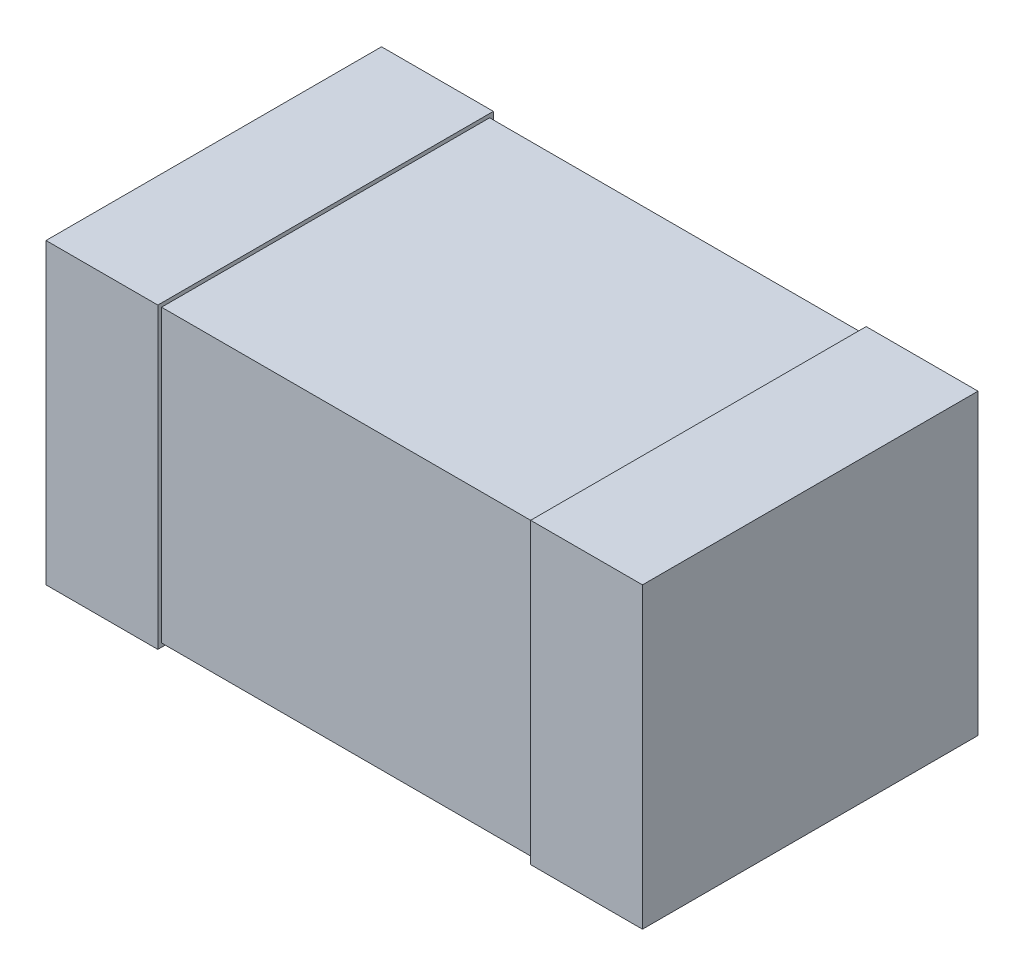
ISO-10303-21;
HEADER;
FILE_DESCRIPTION(('STEP AP214'),'2;1');
FILE_NAME('part.step','',(''),(''),'','','');
FILE_SCHEMA(('AUTOMOTIVE_DESIGN { 1 0 10303 214 1 1 1 1 }'));
ENDSEC;
DATA;
#1=APPLICATION_CONTEXT('core data for automotive mechanical design processes');
#2=APPLICATION_PROTOCOL_DEFINITION('international standard','automotive_design',2000,#1);
#3=PRODUCT_CONTEXT('',#1,'mechanical');
#4=PRODUCT('Part','Part','',(#3));
#5=PRODUCT_RELATED_PRODUCT_CATEGORY('part','',(#4));
#6=PRODUCT_DEFINITION_FORMATION('','',#4);
#7=PRODUCT_DEFINITION_CONTEXT('part definition',#1,'design');
#8=PRODUCT_DEFINITION('design','',#6,#7);
#9=PRODUCT_DEFINITION_SHAPE('','',#8);
#10=(LENGTH_UNIT() NAMED_UNIT(*) SI_UNIT(.MILLI.,.METRE.));
#11=(NAMED_UNIT(*) PLANE_ANGLE_UNIT() SI_UNIT($,.RADIAN.));
#12=(NAMED_UNIT(*) SI_UNIT($,.STERADIAN.) SOLID_ANGLE_UNIT());
#13=UNCERTAINTY_MEASURE_WITH_UNIT(LENGTH_MEASURE(1.E-05),#10,'distance_accuracy_value','');
#14=(GEOMETRIC_REPRESENTATION_CONTEXT(3) GLOBAL_UNCERTAINTY_ASSIGNED_CONTEXT((#13)) GLOBAL_UNIT_ASSIGNED_CONTEXT((#10,
#11,#12)) REPRESENTATION_CONTEXT('',''));
#15=CARTESIAN_POINT('',(0.,0.,0.));
#16=DIRECTION('',(0.,0.,1.));
#17=DIRECTION('',(1.,0.,0.));
#18=AXIS2_PLACEMENT_3D('',#15,#16,#17);
#19=CARTESIAN_POINT('',(0.8,-0.4,-0.45));
#20=DIRECTION('',(-1.,0.,0.));
#21=DIRECTION('',(0.,0.,1.));
#22=AXIS2_PLACEMENT_3D('',#19,#20,#21);
#23=PLANE('',#22);
#24=DIRECTION('',(0.,0.,-1.));
#25=VECTOR('',#24,1.);
#26=CARTESIAN_POINT('',(0.8,0.4,0.));
#27=LINE('',#26,#25);
#28=CARTESIAN_POINT('',(0.8,0.4,0.45));
#29=VERTEX_POINT('',#28);
#30=CARTESIAN_POINT('',(0.8,0.4,-0.45));
#31=VERTEX_POINT('',#30);
#32=EDGE_CURVE('E126',#29,#31,#27,.T.);
#33=ORIENTED_EDGE('',*,*,#32,.F.);
#34=DIRECTION('',(0.,1.,0.));
#35=VECTOR('',#34,1.);
#36=CARTESIAN_POINT('',(0.8,0.,0.45));
#37=LINE('',#36,#35);
#38=CARTESIAN_POINT('',(0.8,-0.4,0.45));
#39=VERTEX_POINT('',#38);
#40=EDGE_CURVE('E119',#39,#29,#37,.T.);
#41=ORIENTED_EDGE('',*,*,#40,.F.);
#42=DIRECTION('',(0.,0.,1.));
#43=VECTOR('',#42,1.);
#44=CARTESIAN_POINT('',(0.8,-0.4,0.));
#45=LINE('',#44,#43);
#46=CARTESIAN_POINT('',(0.8,-0.4,-0.45));
#47=VERTEX_POINT('',#46);
#48=EDGE_CURVE('E103',#47,#39,#45,.T.);
#49=ORIENTED_EDGE('',*,*,#48,.F.);
#50=DIRECTION('',(0.,-1.,0.));
#51=VECTOR('',#50,1.);
#52=CARTESIAN_POINT('',(0.8,0.,-0.45));
#53=LINE('',#52,#51);
#54=EDGE_CURVE('E20',#31,#47,#53,.T.);
#55=ORIENTED_EDGE('',*,*,#54,.F.);
#56=EDGE_LOOP('',(#33,#41,#49,#55));
#57=FACE_BOUND('',#56,.T.);
#58=ADVANCED_FACE('F16',(#57),#23,.F.);
#59=CARTESIAN_POINT('',(-0.8,-0.4,-0.45));
#60=DIRECTION('',(-1.,0.,0.));
#61=DIRECTION('',(0.,0.,1.));
#62=AXIS2_PLACEMENT_3D('',#59,#60,#61);
#63=PLANE('',#62);
#64=DIRECTION('',(0.,0.,1.));
#65=VECTOR('',#64,1.);
#66=CARTESIAN_POINT('',(-0.8,0.4,0.));
#67=LINE('',#66,#65);
#68=CARTESIAN_POINT('',(-0.8,0.4,-0.45));
#69=VERTEX_POINT('',#68);
#70=CARTESIAN_POINT('',(-0.8,0.4,0.45));
#71=VERTEX_POINT('',#70);
#72=EDGE_CURVE('E134',#69,#71,#67,.T.);
#73=ORIENTED_EDGE('',*,*,#72,.F.);
#74=DIRECTION('',(0.,1.,0.));
#75=VECTOR('',#74,1.);
#76=CARTESIAN_POINT('',(-0.8,0.,-0.45));
#77=LINE('',#76,#75);
#78=CARTESIAN_POINT('',(-0.8,-0.4,-0.45));
#79=VERTEX_POINT('',#78);
#80=EDGE_CURVE('E138',#79,#69,#77,.T.);
#81=ORIENTED_EDGE('',*,*,#80,.F.);
#82=DIRECTION('',(0.,0.,-1.));
#83=VECTOR('',#82,1.);
#84=CARTESIAN_POINT('',(-0.8,-0.4,0.));
#85=LINE('',#84,#83);
#86=CARTESIAN_POINT('',(-0.8,-0.4,0.45));
#87=VERTEX_POINT('',#86);
#88=EDGE_CURVE('E142',#87,#79,#85,.T.);
#89=ORIENTED_EDGE('',*,*,#88,.F.);
#90=DIRECTION('',(0.,-1.,0.));
#91=VECTOR('',#90,1.);
#92=CARTESIAN_POINT('',(-0.8,0.,0.45));
#93=LINE('',#92,#91);
#94=EDGE_CURVE('E132',#71,#87,#93,.T.);
#95=ORIENTED_EDGE('',*,*,#94,.F.);
#96=EDGE_LOOP('',(#73,#81,#89,#95));
#97=FACE_BOUND('',#96,.T.);
#98=ADVANCED_FACE('F232',(#97),#63,.T.);
#99=CARTESIAN_POINT('',(0.8,-0.4,-0.45));
#100=DIRECTION('',(0.,0.,-1.));
#101=DIRECTION('',(-1.,0.,0.));
#102=AXIS2_PLACEMENT_3D('',#99,#100,#101);
#103=PLANE('',#102);
#104=DIRECTION('',(0.,-1.,0.));
#105=VECTOR('',#104,1.);
#106=CARTESIAN_POINT('',(0.5,0.,-0.45));
#107=LINE('',#106,#105);
#108=CARTESIAN_POINT('',(0.5,0.4,-0.45));
#109=VERTEX_POINT('',#108);
#110=CARTESIAN_POINT('',(0.5,-0.4,-0.45));
#111=VERTEX_POINT('',#110);
#112=EDGE_CURVE('E152',#109,#111,#107,.T.);
#113=ORIENTED_EDGE('',*,*,#112,.F.);
#114=DIRECTION('',(-1.,0.,0.));
#115=VECTOR('',#114,1.);
#116=CARTESIAN_POINT('',(0.65,0.4,-0.45));
#117=LINE('',#116,#115);
#118=EDGE_CURVE('E114',#31,#109,#117,.T.);
#119=ORIENTED_EDGE('',*,*,#118,.F.);
#120=ORIENTED_EDGE('',*,*,#54,.T.);
#121=DIRECTION('',(1.,0.,0.));
#122=VECTOR('',#121,1.);
#123=CARTESIAN_POINT('',(0.65,-0.4,-0.45));
#124=LINE('',#123,#122);
#125=EDGE_CURVE('E112',#111,#47,#124,.T.);
#126=ORIENTED_EDGE('',*,*,#125,.F.);
#127=EDGE_LOOP('',(#113,#119,#120,#126));
#128=FACE_BOUND('',#127,.T.);
#129=ADVANCED_FACE('F111',(#128),#103,.T.);
#130=CARTESIAN_POINT('',(0.5,-0.4,0.45));
#131=DIRECTION('',(0.,-1.,0.));
#132=DIRECTION('',(0.,0.,-1.));
#133=AXIS2_PLACEMENT_3D('',#130,#131,#132);
#134=PLANE('',#133);
#135=DIRECTION('',(0.,0.,1.));
#136=VECTOR('',#135,1.);
#137=CARTESIAN_POINT('',(0.5,-0.4,0.));
#138=LINE('',#137,#136);
#139=CARTESIAN_POINT('',(0.5,-0.4,0.45));
#140=VERTEX_POINT('',#139);
#141=EDGE_CURVE('E118',#111,#140,#138,.T.);
#142=ORIENTED_EDGE('',*,*,#141,.F.);
#143=ORIENTED_EDGE('',*,*,#125,.T.);
#144=ORIENTED_EDGE('',*,*,#48,.T.);
#145=DIRECTION('',(1.,0.,0.));
#146=VECTOR('',#145,1.);
#147=CARTESIAN_POINT('',(0.65,-0.4,0.45));
#148=LINE('',#147,#146);
#149=EDGE_CURVE('E124',#140,#39,#148,.T.);
#150=ORIENTED_EDGE('',*,*,#149,.F.);
#151=EDGE_LOOP('',(#142,#143,#144,#150));
#152=FACE_BOUND('',#151,.T.);
#153=ADVANCED_FACE('F117',(#152),#134,.T.);
#154=CARTESIAN_POINT('',(0.5,-0.4,0.45));
#155=DIRECTION('',(0.,0.,1.));
#156=DIRECTION('',(1.,0.,0.));
#157=AXIS2_PLACEMENT_3D('',#154,#155,#156);
#158=PLANE('',#157);
#159=DIRECTION('',(0.,1.,0.));
#160=VECTOR('',#159,1.);
#161=CARTESIAN_POINT('',(0.5,0.,0.45));
#162=LINE('',#161,#160);
#163=CARTESIAN_POINT('',(0.5,0.4,0.45));
#164=VERTEX_POINT('',#163);
#165=EDGE_CURVE('E155',#140,#164,#162,.T.);
#166=ORIENTED_EDGE('',*,*,#165,.F.);
#167=ORIENTED_EDGE('',*,*,#149,.T.);
#168=ORIENTED_EDGE('',*,*,#40,.T.);
#169=DIRECTION('',(1.,0.,0.));
#170=VECTOR('',#169,1.);
#171=CARTESIAN_POINT('',(0.65,0.4,0.45));
#172=LINE('',#171,#170);
#173=EDGE_CURVE('E129',#164,#29,#172,.T.);
#174=ORIENTED_EDGE('',*,*,#173,.F.);
#175=EDGE_LOOP('',(#166,#167,#168,#174));
#176=FACE_BOUND('',#175,.T.);
#177=ADVANCED_FACE('F308',(#176),#158,.T.);
#178=CARTESIAN_POINT('',(0.5,0.4,-0.45));
#179=DIRECTION('',(0.,1.,0.));
#180=DIRECTION('',(0.,0.,1.));
#181=AXIS2_PLACEMENT_3D('',#178,#179,#180);
#182=PLANE('',#181);
#183=DIRECTION('',(0.,0.,-1.));
#184=VECTOR('',#183,1.);
#185=CARTESIAN_POINT('',(0.5,0.4,0.));
#186=LINE('',#185,#184);
#187=EDGE_CURVE('E157',#164,#109,#186,.T.);
#188=ORIENTED_EDGE('',*,*,#187,.F.);
#189=ORIENTED_EDGE('',*,*,#173,.T.);
#190=ORIENTED_EDGE('',*,*,#32,.T.);
#191=ORIENTED_EDGE('',*,*,#118,.T.);
#192=EDGE_LOOP('',(#188,#189,#190,#191));
#193=FACE_BOUND('',#192,.T.);
#194=ADVANCED_FACE('F301',(#193),#182,.T.);
#195=CARTESIAN_POINT('',(-0.8,-0.4,0.45));
#196=DIRECTION('',(0.,0.,1.));
#197=DIRECTION('',(1.,0.,0.));
#198=AXIS2_PLACEMENT_3D('',#195,#196,#197);
#199=PLANE('',#198);
#200=DIRECTION('',(0.,1.,0.));
#201=VECTOR('',#200,1.);
#202=CARTESIAN_POINT('',(-0.5,0.,0.45));
#203=LINE('',#202,#201);
#204=CARTESIAN_POINT('',(-0.5,-0.4,0.45));
#205=VERTEX_POINT('',#204);
#206=CARTESIAN_POINT('',(-0.5,0.4,0.45));
#207=VERTEX_POINT('',#206);
#208=EDGE_CURVE('E170',#205,#207,#203,.T.);
#209=ORIENTED_EDGE('',*,*,#208,.T.);
#210=DIRECTION('',(1.,0.,0.));
#211=VECTOR('',#210,1.);
#212=CARTESIAN_POINT('',(-0.65,0.4,0.45));
#213=LINE('',#212,#211);
#214=EDGE_CURVE('E136',#71,#207,#213,.T.);
#215=ORIENTED_EDGE('',*,*,#214,.F.);
#216=ORIENTED_EDGE('',*,*,#94,.T.);
#217=DIRECTION('',(-1.,0.,0.));
#218=VECTOR('',#217,1.);
#219=CARTESIAN_POINT('',(-0.65,-0.4,0.45));
#220=LINE('',#219,#218);
#221=EDGE_CURVE('E146',#205,#87,#220,.T.);
#222=ORIENTED_EDGE('',*,*,#221,.F.);
#223=EDGE_LOOP('',(#209,#215,#216,#222));
#224=FACE_BOUND('',#223,.T.);
#225=ADVANCED_FACE('F224',(#224),#199,.T.);
#226=CARTESIAN_POINT('',(-0.8,0.4,-0.45));
#227=DIRECTION('',(0.,1.,0.));
#228=DIRECTION('',(0.,0.,1.));
#229=AXIS2_PLACEMENT_3D('',#226,#227,#228);
#230=PLANE('',#229);
#231=DIRECTION('',(0.,0.,-1.));
#232=VECTOR('',#231,1.);
#233=CARTESIAN_POINT('',(-0.5,0.4,0.));
#234=LINE('',#233,#232);
#235=CARTESIAN_POINT('',(-0.5,0.4,-0.45));
#236=VERTEX_POINT('',#235);
#237=EDGE_CURVE('E173',#207,#236,#234,.T.);
#238=ORIENTED_EDGE('',*,*,#237,.T.);
#239=DIRECTION('',(1.,0.,0.));
#240=VECTOR('',#239,1.);
#241=CARTESIAN_POINT('',(-0.65,0.4,-0.45));
#242=LINE('',#241,#240);
#243=EDGE_CURVE('E140',#69,#236,#242,.T.);
#244=ORIENTED_EDGE('',*,*,#243,.F.);
#245=ORIENTED_EDGE('',*,*,#72,.T.);
#246=ORIENTED_EDGE('',*,*,#214,.T.);
#247=EDGE_LOOP('',(#238,#244,#245,#246));
#248=FACE_BOUND('',#247,.T.);
#249=ADVANCED_FACE('F219',(#248),#230,.T.);
#250=CARTESIAN_POINT('',(-0.5,-0.4,-0.45));
#251=DIRECTION('',(0.,0.,-1.));
#252=DIRECTION('',(-1.,0.,0.));
#253=AXIS2_PLACEMENT_3D('',#250,#251,#252);
#254=PLANE('',#253);
#255=DIRECTION('',(0.,-1.,0.));
#256=VECTOR('',#255,1.);
#257=CARTESIAN_POINT('',(-0.5,0.,-0.45));
#258=LINE('',#257,#256);
#259=CARTESIAN_POINT('',(-0.5,-0.4,-0.45));
#260=VERTEX_POINT('',#259);
#261=EDGE_CURVE('E176',#236,#260,#258,.T.);
#262=ORIENTED_EDGE('',*,*,#261,.T.);
#263=DIRECTION('',(1.,0.,0.));
#264=VECTOR('',#263,1.);
#265=CARTESIAN_POINT('',(-0.65,-0.4,-0.45));
#266=LINE('',#265,#264);
#267=EDGE_CURVE('E144',#79,#260,#266,.T.);
#268=ORIENTED_EDGE('',*,*,#267,.F.);
#269=ORIENTED_EDGE('',*,*,#80,.T.);
#270=ORIENTED_EDGE('',*,*,#243,.T.);
#271=EDGE_LOOP('',(#262,#268,#269,#270));
#272=FACE_BOUND('',#271,.T.);
#273=ADVANCED_FACE('F230',(#272),#254,.T.);
#274=CARTESIAN_POINT('',(-0.8,-0.4,0.45));
#275=DIRECTION('',(0.,-1.,0.));
#276=DIRECTION('',(0.,0.,-1.));
#277=AXIS2_PLACEMENT_3D('',#274,#275,#276);
#278=PLANE('',#277);
#279=DIRECTION('',(0.,0.,1.));
#280=VECTOR('',#279,1.);
#281=CARTESIAN_POINT('',(-0.5,-0.4,0.));
#282=LINE('',#281,#280);
#283=EDGE_CURVE('E179',#260,#205,#282,.T.);
#284=ORIENTED_EDGE('',*,*,#283,.T.);
#285=ORIENTED_EDGE('',*,*,#221,.T.);
#286=ORIENTED_EDGE('',*,*,#88,.T.);
#287=ORIENTED_EDGE('',*,*,#267,.T.);
#288=EDGE_LOOP('',(#284,#285,#286,#287));
#289=FACE_BOUND('',#288,.T.);
#290=ADVANCED_FACE('F228',(#289),#278,.T.);
#291=CARTESIAN_POINT('',(0.5,-0.39,0.44));
#292=DIRECTION('',(0.,0.,-1.));
#293=DIRECTION('',(-1.,0.,0.));
#294=AXIS2_PLACEMENT_3D('',#291,#292,#293);
#295=PLANE('',#294);
#296=DIRECTION('',(1.,0.,0.));
#297=VECTOR('',#296,1.);
#298=CARTESIAN_POINT('',(0.,-0.39,0.44));
#299=LINE('',#298,#297);
#300=CARTESIAN_POINT('',(-0.5,-0.39,0.440000000025));
#301=VERTEX_POINT('',#300);
#302=CARTESIAN_POINT('',(0.5,-0.39,0.440000000025));
#303=VERTEX_POINT('',#302);
#304=EDGE_CURVE('E149',#301,#303,#299,.T.);
#305=ORIENTED_EDGE('',*,*,#304,.T.);
#306=DIRECTION('',(0.,-1.,0.));
#307=VECTOR('',#306,1.);
#308=CARTESIAN_POINT('',(0.5,0.,0.4400000001));
#309=LINE('',#308,#307);
#310=CARTESIAN_POINT('',(0.5,0.39,0.44000000005));
#311=VERTEX_POINT('',#310);
#312=EDGE_CURVE('E160',#311,#303,#309,.T.);
#313=ORIENTED_EDGE('',*,*,#312,.F.);
#314=DIRECTION('',(-1.,0.,0.));
#315=VECTOR('',#314,1.);
#316=CARTESIAN_POINT('',(0.,0.39,0.44));
#317=LINE('',#316,#315);
#318=CARTESIAN_POINT('',(-0.5,0.39,0.440000000025));
#319=VERTEX_POINT('',#318);
#320=EDGE_CURVE('E167',#311,#319,#317,.T.);
#321=ORIENTED_EDGE('',*,*,#320,.T.);
#322=DIRECTION('',(0.,-1.,0.));
#323=VECTOR('',#322,1.);
#324=CARTESIAN_POINT('',(-0.5,0.,0.4400000001));
#325=LINE('',#324,#323);
#326=EDGE_CURVE('E182',#319,#301,#325,.T.);
#327=ORIENTED_EDGE('',*,*,#326,.T.);
#328=EDGE_LOOP('',(#305,#313,#321,#327));
#329=FACE_BOUND('',#328,.T.);
#330=ADVANCED_FACE('F269',(#329),#295,.F.);
#331=CARTESIAN_POINT('',(-0.5,-0.39,-0.44));
#332=DIRECTION('',(0.,1.,0.));
#333=DIRECTION('',(0.,0.,1.));
#334=AXIS2_PLACEMENT_3D('',#331,#332,#333);
#335=PLANE('',#334);
#336=DIRECTION('',(1.,0.,0.));
#337=VECTOR('',#336,1.);
#338=CARTESIAN_POINT('',(0.,-0.39,-0.44));
#339=LINE('',#338,#337);
#340=CARTESIAN_POINT('',(-0.5,-0.39,-0.440000000025));
#341=VERTEX_POINT('',#340);
#342=CARTESIAN_POINT('',(0.5,-0.39,-0.440000000025));
#343=VERTEX_POINT('',#342);
#344=EDGE_CURVE('E189',#341,#343,#339,.T.);
#345=ORIENTED_EDGE('',*,*,#344,.T.);
#346=DIRECTION('',(0.,0.,-1.));
#347=VECTOR('',#346,1.);
#348=CARTESIAN_POINT('',(0.5,-0.39,0.));
#349=LINE('',#348,#347);
#350=EDGE_CURVE('E162',#303,#343,#349,.T.);
#351=ORIENTED_EDGE('',*,*,#350,.F.);
#352=ORIENTED_EDGE('',*,*,#304,.F.);
#353=DIRECTION('',(0.,0.,-1.));
#354=VECTOR('',#353,1.);
#355=CARTESIAN_POINT('',(-0.5,-0.39,0.));
#356=LINE('',#355,#354);
#357=EDGE_CURVE('E185',#301,#341,#356,.T.);
#358=ORIENTED_EDGE('',*,*,#357,.T.);
#359=EDGE_LOOP('',(#345,#351,#352,#358));
#360=FACE_BOUND('',#359,.T.);
#361=ADVANCED_FACE('F207',(#360),#335,.F.);
#362=CARTESIAN_POINT('',(0.5,-0.4,-0.45));
#363=DIRECTION('',(-1.,0.,0.));
#364=DIRECTION('',(0.,0.,1.));
#365=AXIS2_PLACEMENT_3D('',#362,#363,#364);
#366=PLANE('',#365);
#367=ORIENTED_EDGE('',*,*,#312,.T.);
#368=ORIENTED_EDGE('',*,*,#350,.T.);
#369=DIRECTION('',(0.,1.,0.));
#370=VECTOR('',#369,1.);
#371=CARTESIAN_POINT('',(0.5,0.,-0.44));
#372=LINE('',#371,#370);
#373=CARTESIAN_POINT('',(0.5,0.39,-0.44000000005));
#374=VERTEX_POINT('',#373);
#375=EDGE_CURVE('E192',#343,#374,#372,.T.);
#376=ORIENTED_EDGE('',*,*,#375,.T.);
#377=DIRECTION('',(0.,0.,1.));
#378=VECTOR('',#377,1.);
#379=CARTESIAN_POINT('',(0.5,0.39,0.));
#380=LINE('',#379,#378);
#381=EDGE_CURVE('E164',#374,#311,#380,.T.);
#382=ORIENTED_EDGE('',*,*,#381,.T.);
#383=EDGE_LOOP('',(#367,#368,#376,#382));
#384=FACE_BOUND('',#383,.T.);
#385=ORIENTED_EDGE('',*,*,#165,.T.);
#386=ORIENTED_EDGE('',*,*,#187,.T.);
#387=ORIENTED_EDGE('',*,*,#112,.T.);
#388=ORIENTED_EDGE('',*,*,#141,.T.);
#389=EDGE_LOOP('',(#385,#386,#387,#388));
#390=FACE_BOUND('',#389,.T.);
#391=ADVANCED_FACE('F203',(#384,#390),#366,.T.);
#392=CARTESIAN_POINT('',(-0.5,0.39,0.44));
#393=DIRECTION('',(0.,-1.,0.));
#394=DIRECTION('',(0.,0.,-1.));
#395=AXIS2_PLACEMENT_3D('',#392,#393,#394);
#396=PLANE('',#395);
#397=ORIENTED_EDGE('',*,*,#320,.F.);
#398=ORIENTED_EDGE('',*,*,#381,.F.);
#399=DIRECTION('',(-1.,0.,0.));
#400=VECTOR('',#399,1.);
#401=CARTESIAN_POINT('',(0.,0.39,-0.44));
#402=LINE('',#401,#400);
#403=CARTESIAN_POINT('',(-0.5,0.39,-0.440000000025));
#404=VERTEX_POINT('',#403);
#405=EDGE_CURVE('E26',#374,#404,#402,.T.);
#406=ORIENTED_EDGE('',*,*,#405,.T.);
#407=DIRECTION('',(0.,0.,1.));
#408=VECTOR('',#407,1.);
#409=CARTESIAN_POINT('',(-0.5,0.39,0.));
#410=LINE('',#409,#408);
#411=EDGE_CURVE('E34',#404,#319,#410,.T.);
#412=ORIENTED_EDGE('',*,*,#411,.T.);
#413=EDGE_LOOP('',(#397,#398,#406,#412));
#414=FACE_BOUND('',#413,.T.);
#415=ADVANCED_FACE('F199',(#414),#396,.F.);
#416=CARTESIAN_POINT('',(-0.5,-0.4,-0.45));
#417=DIRECTION('',(-1.,0.,0.));
#418=DIRECTION('',(0.,0.,1.));
#419=AXIS2_PLACEMENT_3D('',#416,#417,#418);
#420=PLANE('',#419);
#421=DIRECTION('',(0.,-1.,0.));
#422=VECTOR('',#421,1.);
#423=CARTESIAN_POINT('',(-0.5,0.,-0.44));
#424=LINE('',#423,#422);
#425=EDGE_CURVE('E10',#404,#341,#424,.T.);
#426=ORIENTED_EDGE('',*,*,#425,.T.);
#427=ORIENTED_EDGE('',*,*,#357,.F.);
#428=ORIENTED_EDGE('',*,*,#326,.F.);
#429=ORIENTED_EDGE('',*,*,#411,.F.);
#430=EDGE_LOOP('',(#426,#427,#428,#429));
#431=FACE_BOUND('',#430,.T.);
#432=ORIENTED_EDGE('',*,*,#261,.F.);
#433=ORIENTED_EDGE('',*,*,#237,.F.);
#434=ORIENTED_EDGE('',*,*,#208,.F.);
#435=ORIENTED_EDGE('',*,*,#283,.F.);
#436=EDGE_LOOP('',(#432,#433,#434,#435));
#437=FACE_BOUND('',#436,.T.);
#438=ADVANCED_FACE('F209',(#431,#437),#420,.F.);
#439=CARTESIAN_POINT('',(-0.5,-0.39,-0.44));
#440=DIRECTION('',(0.,0.,1.));
#441=DIRECTION('',(1.,0.,0.));
#442=AXIS2_PLACEMENT_3D('',#439,#440,#441);
#443=PLANE('',#442);
#444=ORIENTED_EDGE('',*,*,#405,.F.);
#445=ORIENTED_EDGE('',*,*,#375,.F.);
#446=ORIENTED_EDGE('',*,*,#344,.F.);
#447=ORIENTED_EDGE('',*,*,#425,.F.);
#448=EDGE_LOOP('',(#444,#445,#446,#447));
#449=FACE_BOUND('',#448,.T.);
#450=ADVANCED_FACE('F18',(#449),#443,.F.);
#451=CLOSED_SHELL('',(#58,#98,#129,#153,#177,#194,#225,#249,#273,#290,#330,#361,#391,#415,#438,#450));
#452=MANIFOLD_SOLID_BREP('B1',#451);
#453=ADVANCED_BREP_SHAPE_REPRESENTATION('',(#18,#452),#14);
#454=SHAPE_DEFINITION_REPRESENTATION(#9,#453);
ENDSEC;
END-ISO-10303-21;
